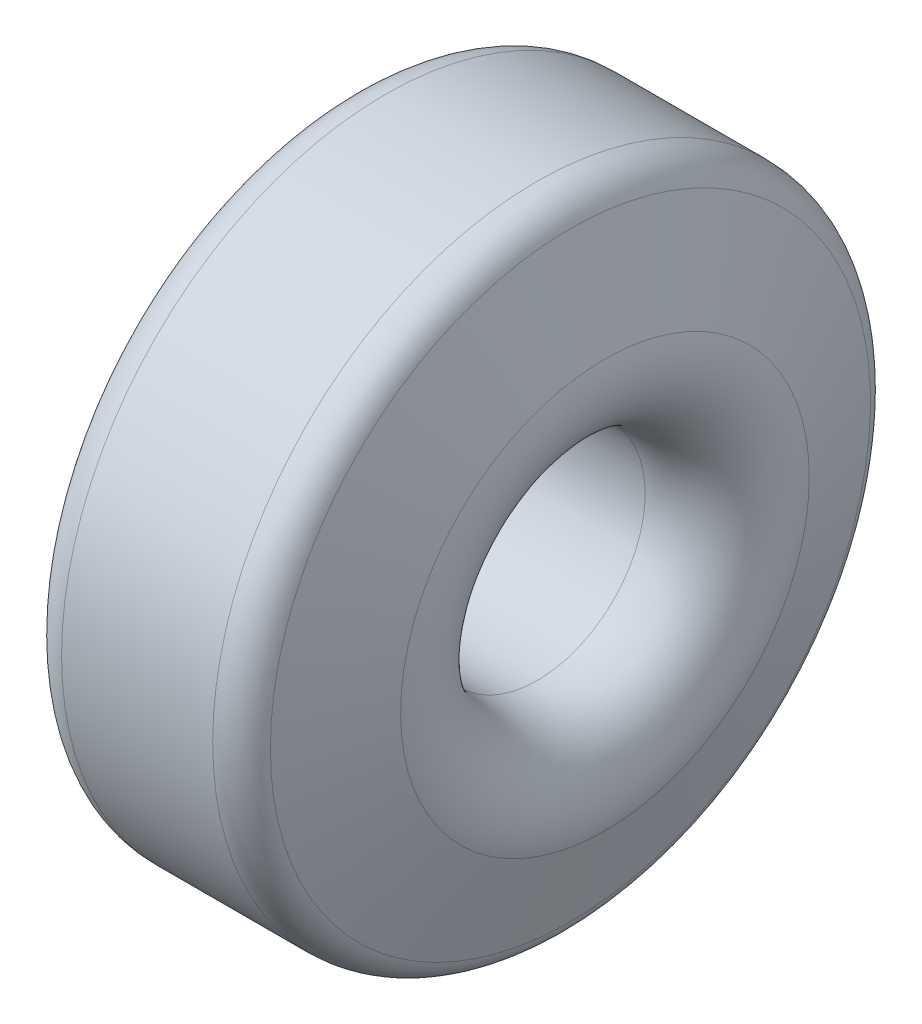
ISO-10303-21;
HEADER;
FILE_DESCRIPTION(('STEP AP214'),'2;1');
FILE_NAME('part.step','',(''),(''),'','','');
FILE_SCHEMA(('AUTOMOTIVE_DESIGN { 1 0 10303 214 1 1 1 1 }'));
ENDSEC;
DATA;
#1=APPLICATION_CONTEXT('core data for automotive mechanical design processes');
#2=APPLICATION_PROTOCOL_DEFINITION('international standard','automotive_design',2000,#1);
#3=PRODUCT_CONTEXT('',#1,'mechanical');
#4=PRODUCT('Part','Part','',(#3));
#5=PRODUCT_RELATED_PRODUCT_CATEGORY('part','',(#4));
#6=PRODUCT_DEFINITION_FORMATION('','',#4);
#7=PRODUCT_DEFINITION_CONTEXT('part definition',#1,'design');
#8=PRODUCT_DEFINITION('design','',#6,#7);
#9=PRODUCT_DEFINITION_SHAPE('','',#8);
#10=(LENGTH_UNIT() NAMED_UNIT(*) SI_UNIT(.MILLI.,.METRE.));
#11=(NAMED_UNIT(*) PLANE_ANGLE_UNIT() SI_UNIT($,.RADIAN.));
#12=(NAMED_UNIT(*) SI_UNIT($,.STERADIAN.) SOLID_ANGLE_UNIT());
#13=UNCERTAINTY_MEASURE_WITH_UNIT(LENGTH_MEASURE(1.E-05),#10,'distance_accuracy_value','');
#14=(GEOMETRIC_REPRESENTATION_CONTEXT(3) GLOBAL_UNCERTAINTY_ASSIGNED_CONTEXT((#13)) GLOBAL_UNIT_ASSIGNED_CONTEXT((#10,
#11,#12)) REPRESENTATION_CONTEXT('',''));
#15=CARTESIAN_POINT('',(0.,0.,0.));
#16=DIRECTION('',(0.,0.,1.));
#17=DIRECTION('',(1.,0.,0.));
#18=AXIS2_PLACEMENT_3D('',#15,#16,#17);
#19=CARTESIAN_POINT('',(-2.54656166753761,0.,0.));
#20=DIRECTION('',(-1.,0.,0.));
#21=DIRECTION('',(0.,0.,1.));
#22=AXIS2_PLACEMENT_3D('',#19,#20,#21);
#23=TOROIDAL_SURFACE('',#22,8.,1.);
#24=CARTESIAN_POINT('',(-3.48729601549075,0.,0.));
#25=DIRECTION('',(-1.,0.,0.));
#26=DIRECTION('',(0.,0.,1.));
#27=AXIS2_PLACEMENT_3D('',#24,#25,#26);
#28=CIRCLE('',#27,8.33914434475778);
#29=CARTESIAN_POINT('',(-3.48729601549075,0.,8.33914434475778));
#30=VERTEX_POINT('',#29);
#31=EDGE_CURVE('E70',#30,#30,#28,.T.);
#32=ORIENTED_EDGE('',*,*,#31,.F.);
#33=EDGE_LOOP('',(#32));
#34=FACE_BOUND('',#33,.T.);
#35=CARTESIAN_POINT('',(-2.54656166753761,0.,0.));
#36=DIRECTION('',(-1.,0.,0.));
#37=DIRECTION('',(0.,0.,1.));
#38=AXIS2_PLACEMENT_3D('',#35,#36,#37);
#39=CIRCLE('',#38,9.);
#40=CARTESIAN_POINT('',(-2.54656166753761,0.,9.));
#41=VERTEX_POINT('',#40);
#42=EDGE_CURVE('E49',#41,#41,#39,.T.);
#43=ORIENTED_EDGE('',*,*,#42,.T.);
#44=EDGE_LOOP('',(#43));
#45=FACE_BOUND('',#44,.T.);
#46=ADVANCED_FACE('F28',(#34,#45),#23,.T.);
#47=CARTESIAN_POINT('',(-29.7112474437628,0.,0.));
#48=DIRECTION('',(-1.,0.,0.));
#49=DIRECTION('',(0.,0.,1.));
#50=AXIS2_PLACEMENT_3D('',#47,#48,#49);
#51=CYLINDRICAL_SURFACE('',#50,9.);
#52=ORIENTED_EDGE('',*,*,#42,.F.);
#53=EDGE_LOOP('',(#52));
#54=FACE_BOUND('',#53,.T.);
#55=CARTESIAN_POINT('',(1.65343833246239,0.,0.));
#56=DIRECTION('',(-1.,0.,0.));
#57=DIRECTION('',(0.,0.,1.));
#58=AXIS2_PLACEMENT_3D('',#55,#56,#57);
#59=CIRCLE('',#58,9.);
#60=CARTESIAN_POINT('',(1.65343833246239,0.,9.));
#61=VERTEX_POINT('',#60);
#62=EDGE_CURVE('E52',#61,#61,#59,.T.);
#63=ORIENTED_EDGE('',*,*,#62,.T.);
#64=EDGE_LOOP('',(#63));
#65=FACE_BOUND('',#64,.T.);
#66=ADVANCED_FACE('F78',(#54,#65),#51,.T.);
#67=CARTESIAN_POINT('',(1.65343833246239,0.,0.));
#68=DIRECTION('',(-1.,0.,0.));
#69=DIRECTION('',(0.,0.,1.));
#70=AXIS2_PLACEMENT_3D('',#67,#68,#69);
#71=TOROIDAL_SURFACE('',#70,8.,1.);
#72=ORIENTED_EDGE('',*,*,#62,.F.);
#73=EDGE_LOOP('',(#72));
#74=FACE_BOUND('',#73,.T.);
#75=CARTESIAN_POINT('',(2.59417268041553,0.,0.));
#76=DIRECTION('',(-1.,0.,0.));
#77=DIRECTION('',(0.,0.,1.));
#78=AXIS2_PLACEMENT_3D('',#75,#76,#77);
#79=CIRCLE('',#78,8.33914434475778);
#80=CARTESIAN_POINT('',(2.59417268041553,0.,8.33914434475778));
#81=VERTEX_POINT('',#80);
#82=EDGE_CURVE('E55',#81,#81,#79,.T.);
#83=ORIENTED_EDGE('',*,*,#82,.T.);
#84=EDGE_LOOP('',(#83));
#85=FACE_BOUND('',#84,.T.);
#86=ADVANCED_FACE('F84',(#74,#85),#71,.T.);
#87=CARTESIAN_POINT('',(3.55343833246239,0.,0.));
#88=DIRECTION('',(-1.,0.,0.));
#89=DIRECTION('',(0.,0.,1.));
#90=AXIS2_PLACEMENT_3D('',#87,#88,#89);
#91=CONICAL_SURFACE('',#90,5.67828868951555,1.22478913953337);
#92=ORIENTED_EDGE('',*,*,#82,.F.);
#93=EDGE_LOOP('',(#92));
#94=FACE_BOUND('',#93,.T.);
#95=CARTESIAN_POINT('',(3.55343833246239,0.,0.));
#96=DIRECTION('',(-1.,0.,0.));
#97=DIRECTION('',(0.,0.,1.));
#98=AXIS2_PLACEMENT_3D('',#95,#96,#97);
#99=CIRCLE('',#98,5.67828868951555);
#100=CARTESIAN_POINT('',(3.55343833246239,0.,5.67828868951555));
#101=VERTEX_POINT('',#100);
#102=EDGE_CURVE('E58',#101,#101,#99,.T.);
#103=ORIENTED_EDGE('',*,*,#102,.T.);
#104=EDGE_LOOP('',(#103));
#105=FACE_BOUND('',#104,.T.);
#106=ADVANCED_FACE('F90',(#94,#105),#91,.T.);
#107=CARTESIAN_POINT('',(1.67196963655612,0.,0.));
#108=DIRECTION('',(-1.,0.,0.));
#109=DIRECTION('',(0.,0.,1.));
#110=AXIS2_PLACEMENT_3D('',#107,#108,#109);
#111=TOROIDAL_SURFACE('',#110,5.,2.);
#112=ORIENTED_EDGE('',*,*,#102,.F.);
#113=EDGE_LOOP('',(#112));
#114=FACE_BOUND('',#113,.T.);
#115=CARTESIAN_POINT('',(1.67196963655612,0.,0.));
#116=DIRECTION('',(-1.,0.,0.));
#117=DIRECTION('',(0.,0.,1.));
#118=AXIS2_PLACEMENT_3D('',#115,#116,#117);
#119=CIRCLE('',#118,3.);
#120=CARTESIAN_POINT('',(1.67196963655612,0.,3.));
#121=VERTEX_POINT('',#120);
#122=EDGE_CURVE('E61',#121,#121,#119,.T.);
#123=ORIENTED_EDGE('',*,*,#122,.T.);
#124=EDGE_LOOP('',(#123));
#125=FACE_BOUND('',#124,.T.);
#126=ADVANCED_FACE('F96',(#114,#125),#111,.T.);
#127=CARTESIAN_POINT('',(-29.7112474437628,0.,0.));
#128=DIRECTION('',(-1.,0.,0.));
#129=DIRECTION('',(0.,0.,1.));
#130=AXIS2_PLACEMENT_3D('',#127,#128,#129);
#131=CYLINDRICAL_SURFACE('',#130,3.);
#132=ORIENTED_EDGE('',*,*,#122,.F.);
#133=EDGE_LOOP('',(#132));
#134=FACE_BOUND('',#133,.T.);
#135=CARTESIAN_POINT('',(-2.56509297163133,0.,0.));
#136=DIRECTION('',(-1.,0.,0.));
#137=DIRECTION('',(0.,0.,1.));
#138=AXIS2_PLACEMENT_3D('',#135,#136,#137);
#139=CIRCLE('',#138,3.);
#140=CARTESIAN_POINT('',(-2.56509297163133,0.,3.));
#141=VERTEX_POINT('',#140);
#142=EDGE_CURVE('E64',#141,#141,#139,.T.);
#143=ORIENTED_EDGE('',*,*,#142,.T.);
#144=EDGE_LOOP('',(#143));
#145=FACE_BOUND('',#144,.T.);
#146=ADVANCED_FACE('F102',(#134,#145),#131,.F.);
#147=CARTESIAN_POINT('',(-2.56509297163133,0.,0.));
#148=DIRECTION('',(-1.,0.,0.));
#149=DIRECTION('',(0.,0.,1.));
#150=AXIS2_PLACEMENT_3D('',#147,#148,#149);
#151=TOROIDAL_SURFACE('',#150,5.,2.);
#152=ORIENTED_EDGE('',*,*,#142,.F.);
#153=EDGE_LOOP('',(#152));
#154=FACE_BOUND('',#153,.T.);
#155=CARTESIAN_POINT('',(-4.44656166753761,0.,0.));
#156=DIRECTION('',(-1.,0.,0.));
#157=DIRECTION('',(0.,0.,1.));
#158=AXIS2_PLACEMENT_3D('',#155,#156,#157);
#159=CIRCLE('',#158,5.67828868951555);
#160=CARTESIAN_POINT('',(-4.44656166753761,0.,5.67828868951555));
#161=VERTEX_POINT('',#160);
#162=EDGE_CURVE('E67',#161,#161,#159,.T.);
#163=ORIENTED_EDGE('',*,*,#162,.T.);
#164=EDGE_LOOP('',(#163));
#165=FACE_BOUND('',#164,.T.);
#166=ADVANCED_FACE('F108',(#154,#165),#151,.T.);
#167=CARTESIAN_POINT('',(-3.48729601549075,0.,0.));
#168=DIRECTION('',(1.,0.,0.));
#169=DIRECTION('',(0.,0.,-1.));
#170=AXIS2_PLACEMENT_3D('',#167,#168,#169);
#171=CONICAL_SURFACE('',#170,8.33914434475778,1.22478913953337);
#172=ORIENTED_EDGE('',*,*,#162,.F.);
#173=EDGE_LOOP('',(#172));
#174=FACE_BOUND('',#173,.T.);
#175=ORIENTED_EDGE('',*,*,#31,.T.);
#176=EDGE_LOOP('',(#175));
#177=FACE_BOUND('',#176,.T.);
#178=ADVANCED_FACE('F74',(#174,#177),#171,.T.);
#179=CLOSED_SHELL('',(#46,#66,#86,#106,#126,#146,#166,#178));
#180=CARTESIAN_POINT('',(-2.69656166753761,8.,0.));
#181=DIRECTION('',(1.,0.,0.));
#182=DIRECTION('',(0.,0.,-1.));
#183=AXIS2_PLACEMENT_3D('',#180,#181,#182);
#184=PLANE('',#183);
#185=CARTESIAN_POINT('',(-2.69656166753761,0.,0.));
#186=DIRECTION('',(-1.,0.,0.));
#187=DIRECTION('',(0.,0.,1.));
#188=AXIS2_PLACEMENT_3D('',#185,#186,#187);
#189=CIRCLE('',#188,5.);
#190=CARTESIAN_POINT('',(-2.69656166753761,0.,5.));
#191=VERTEX_POINT('',#190);
#192=EDGE_CURVE('E10',#191,#191,#189,.T.);
#193=ORIENTED_EDGE('',*,*,#192,.T.);
#194=EDGE_LOOP('',(#193));
#195=FACE_BOUND('',#194,.T.);
#196=CARTESIAN_POINT('',(-2.69656166753761,0.,0.));
#197=DIRECTION('',(-1.,0.,0.));
#198=DIRECTION('',(0.,0.,1.));
#199=AXIS2_PLACEMENT_3D('',#196,#197,#198);
#200=CIRCLE('',#199,8.);
#201=CARTESIAN_POINT('',(-2.69656166753761,0.,8.));
#202=VERTEX_POINT('',#201);
#203=EDGE_CURVE('E44',#202,#202,#200,.T.);
#204=ORIENTED_EDGE('',*,*,#203,.F.);
#205=EDGE_LOOP('',(#204));
#206=FACE_BOUND('',#205,.T.);
#207=ADVANCED_FACE('F30',(#195,#206),#184,.T.);
#208=CARTESIAN_POINT('',(-29.7112474437628,0.,0.));
#209=DIRECTION('',(-1.,0.,0.));
#210=DIRECTION('',(0.,0.,1.));
#211=AXIS2_PLACEMENT_3D('',#208,#209,#210);
#212=CYLINDRICAL_SURFACE('',#211,5.);
#213=CARTESIAN_POINT('',(1.8034383324624,0.,0.));
#214=DIRECTION('',(-1.,0.,0.));
#215=DIRECTION('',(0.,0.,1.));
#216=AXIS2_PLACEMENT_3D('',#213,#214,#215);
#217=CIRCLE('',#216,5.);
#218=CARTESIAN_POINT('',(1.8034383324624,0.,5.));
#219=VERTEX_POINT('',#218);
#220=EDGE_CURVE('E36',#219,#219,#217,.T.);
#221=ORIENTED_EDGE('',*,*,#220,.T.);
#222=EDGE_LOOP('',(#221));
#223=FACE_BOUND('',#222,.T.);
#224=ORIENTED_EDGE('',*,*,#192,.F.);
#225=EDGE_LOOP('',(#224));
#226=FACE_BOUND('',#225,.T.);
#227=ADVANCED_FACE('F130',(#223,#226),#212,.T.);
#228=CARTESIAN_POINT('',(1.80343833246239,8.,0.));
#229=DIRECTION('',(-1.,0.,0.));
#230=DIRECTION('',(0.,0.,1.));
#231=AXIS2_PLACEMENT_3D('',#228,#229,#230);
#232=PLANE('',#231);
#233=CARTESIAN_POINT('',(1.80343833246239,0.,0.));
#234=DIRECTION('',(-1.,0.,0.));
#235=DIRECTION('',(0.,0.,1.));
#236=AXIS2_PLACEMENT_3D('',#233,#234,#235);
#237=CIRCLE('',#236,8.);
#238=CARTESIAN_POINT('',(1.80343833246239,0.,8.));
#239=VERTEX_POINT('',#238);
#240=EDGE_CURVE('E40',#239,#239,#237,.T.);
#241=ORIENTED_EDGE('',*,*,#240,.T.);
#242=EDGE_LOOP('',(#241));
#243=FACE_BOUND('',#242,.T.);
#244=ORIENTED_EDGE('',*,*,#220,.F.);
#245=EDGE_LOOP('',(#244));
#246=FACE_BOUND('',#245,.T.);
#247=ADVANCED_FACE('F126',(#243,#246),#232,.T.);
#248=CARTESIAN_POINT('',(-29.7112474437628,0.,0.));
#249=DIRECTION('',(-1.,0.,0.));
#250=DIRECTION('',(0.,0.,1.));
#251=AXIS2_PLACEMENT_3D('',#248,#249,#250);
#252=CYLINDRICAL_SURFACE('',#251,8.);
#253=ORIENTED_EDGE('',*,*,#203,.T.);
#254=EDGE_LOOP('',(#253));
#255=FACE_BOUND('',#254,.T.);
#256=ORIENTED_EDGE('',*,*,#240,.F.);
#257=EDGE_LOOP('',(#256));
#258=FACE_BOUND('',#257,.T.);
#259=ADVANCED_FACE('F123',(#255,#258),#252,.F.);
#260=CLOSED_SHELL('',(#207,#227,#247,#259));
#261=ORIENTED_CLOSED_SHELL('',*,#260,.T.);
#262=BREP_WITH_VOIDS('B2',#179,(#261));
#263=ADVANCED_BREP_SHAPE_REPRESENTATION('',(#18,#262),#14);
#264=SHAPE_DEFINITION_REPRESENTATION(#9,#263);
ENDSEC;
END-ISO-10303-21;
